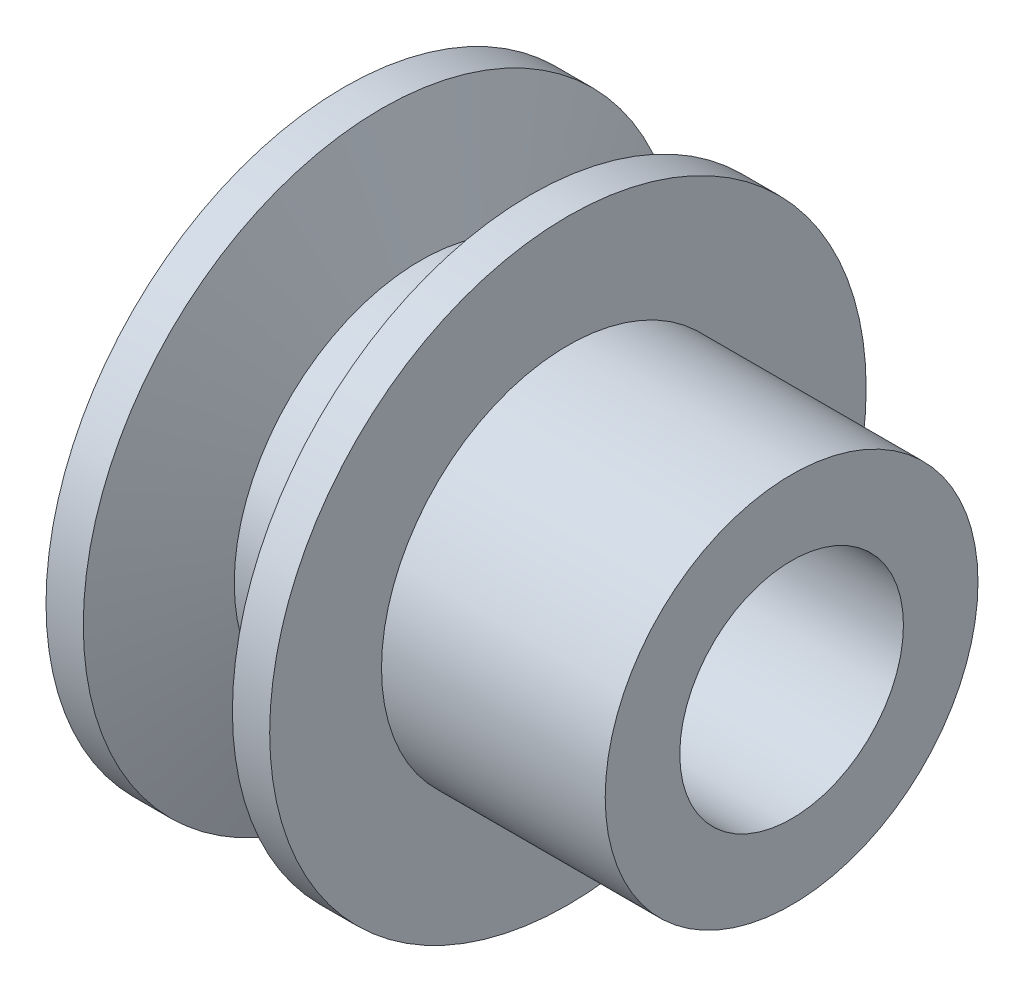
ISO-10303-21;
HEADER;
FILE_DESCRIPTION(('STEP AP214'),'2;1');
FILE_NAME('part.step','',(''),(''),'','','');
FILE_SCHEMA(('AUTOMOTIVE_DESIGN { 1 0 10303 214 1 1 1 1 }'));
ENDSEC;
DATA;
#1=APPLICATION_CONTEXT('core data for automotive mechanical design processes');
#2=APPLICATION_PROTOCOL_DEFINITION('international standard','automotive_design',2000,#1);
#3=PRODUCT_CONTEXT('',#1,'mechanical');
#4=PRODUCT('Part','Part','',(#3));
#5=PRODUCT_RELATED_PRODUCT_CATEGORY('part','',(#4));
#6=PRODUCT_DEFINITION_FORMATION('','',#4);
#7=PRODUCT_DEFINITION_CONTEXT('part definition',#1,'design');
#8=PRODUCT_DEFINITION('design','',#6,#7);
#9=PRODUCT_DEFINITION_SHAPE('','',#8);
#10=(LENGTH_UNIT() NAMED_UNIT(*) SI_UNIT(.MILLI.,.METRE.));
#11=(NAMED_UNIT(*) PLANE_ANGLE_UNIT() SI_UNIT($,.RADIAN.));
#12=(NAMED_UNIT(*) SI_UNIT($,.STERADIAN.) SOLID_ANGLE_UNIT());
#13=UNCERTAINTY_MEASURE_WITH_UNIT(LENGTH_MEASURE(1.E-05),#10,'distance_accuracy_value','');
#14=(GEOMETRIC_REPRESENTATION_CONTEXT(3) GLOBAL_UNCERTAINTY_ASSIGNED_CONTEXT((#13)) GLOBAL_UNIT_ASSIGNED_CONTEXT((#10,
#11,#12)) REPRESENTATION_CONTEXT('',''));
#15=CARTESIAN_POINT('',(0.,0.,0.));
#16=DIRECTION('',(0.,0.,1.));
#17=DIRECTION('',(1.,0.,0.));
#18=AXIS2_PLACEMENT_3D('',#15,#16,#17);
#19=CARTESIAN_POINT('',(-9.34873949579832,35.2170868347339,0.));
#20=DIRECTION('',(1.,0.,0.));
#21=DIRECTION('',(0.,0.,-1.));
#22=AXIS2_PLACEMENT_3D('',#19,#20,#21);
#23=PLANE('',#22);
#24=CARTESIAN_POINT('',(-9.34873949579832,0.,0.));
#25=DIRECTION('',(-1.,0.,0.));
#26=DIRECTION('',(0.,0.,1.));
#27=AXIS2_PLACEMENT_3D('',#24,#25,#26);
#28=CIRCLE('',#27,20.);
#29=CARTESIAN_POINT('',(-9.34873949579832,0.,20.));
#30=VERTEX_POINT('',#29);
#31=EDGE_CURVE('E10',#30,#30,#28,.T.);
#32=ORIENTED_EDGE('',*,*,#31,.F.);
#33=EDGE_LOOP('',(#32));
#34=FACE_BOUND('',#33,.T.);
#35=CARTESIAN_POINT('',(-9.34873949579832,0.,0.));
#36=DIRECTION('',(-1.,0.,0.));
#37=DIRECTION('',(0.,0.,1.));
#38=AXIS2_PLACEMENT_3D('',#35,#36,#37);
#39=CIRCLE('',#38,40.);
#40=CARTESIAN_POINT('',(-9.34873949579832,0.,40.));
#41=VERTEX_POINT('',#40);
#42=EDGE_CURVE('E72',#41,#41,#39,.T.);
#43=ORIENTED_EDGE('',*,*,#42,.T.);
#44=EDGE_LOOP('',(#43));
#45=FACE_BOUND('',#44,.T.);
#46=ADVANCED_FACE('F35',(#34,#45),#23,.F.);
#47=CARTESIAN_POINT('',(-9.34873949579832,0.,0.));
#48=DIRECTION('',(-1.,0.,0.));
#49=DIRECTION('',(0.,0.,1.));
#50=AXIS2_PLACEMENT_3D('',#47,#48,#49);
#51=CONICAL_SURFACE('',#50,20.,0.785398163397449);
#52=CARTESIAN_POINT('',(-4.34873949579832,0.,0.));
#53=DIRECTION('',(-1.,0.,0.));
#54=DIRECTION('',(0.,0.,1.));
#55=AXIS2_PLACEMENT_3D('',#52,#53,#54);
#56=CIRCLE('',#55,15.);
#57=CARTESIAN_POINT('',(-4.34873949579832,0.,15.));
#58=VERTEX_POINT('',#57);
#59=EDGE_CURVE('E41',#58,#58,#56,.T.);
#60=ORIENTED_EDGE('',*,*,#59,.F.);
#61=EDGE_LOOP('',(#60));
#62=FACE_BOUND('',#61,.T.);
#63=ORIENTED_EDGE('',*,*,#31,.T.);
#64=EDGE_LOOP('',(#63));
#65=FACE_BOUND('',#64,.T.);
#66=ADVANCED_FACE('F127',(#62,#65),#51,.F.);
#67=CARTESIAN_POINT('',(-23.1967787114846,0.,0.));
#68=DIRECTION('',(-1.,0.,0.));
#69=DIRECTION('',(0.,0.,1.));
#70=AXIS2_PLACEMENT_3D('',#67,#68,#69);
#71=CYLINDRICAL_SURFACE('',#70,15.);
#72=CARTESIAN_POINT('',(50.6512605042017,0.,0.));
#73=DIRECTION('',(-1.,0.,0.));
#74=DIRECTION('',(0.,0.,1.));
#75=AXIS2_PLACEMENT_3D('',#72,#73,#74);
#76=CIRCLE('',#75,15.);
#77=CARTESIAN_POINT('',(50.6512605042017,0.,15.));
#78=VERTEX_POINT('',#77);
#79=EDGE_CURVE('E45',#78,#78,#76,.T.);
#80=ORIENTED_EDGE('',*,*,#79,.F.);
#81=EDGE_LOOP('',(#80));
#82=FACE_BOUND('',#81,.T.);
#83=ORIENTED_EDGE('',*,*,#59,.T.);
#84=EDGE_LOOP('',(#83));
#85=FACE_BOUND('',#84,.T.);
#86=ADVANCED_FACE('F122',(#82,#85),#71,.F.);
#87=CARTESIAN_POINT('',(50.6512605042017,15.,0.));
#88=DIRECTION('',(-1.,0.,0.));
#89=DIRECTION('',(0.,0.,1.));
#90=AXIS2_PLACEMENT_3D('',#87,#88,#89);
#91=PLANE('',#90);
#92=CARTESIAN_POINT('',(50.6512605042017,0.,0.));
#93=DIRECTION('',(-1.,0.,0.));
#94=DIRECTION('',(0.,0.,1.));
#95=AXIS2_PLACEMENT_3D('',#92,#93,#94);
#96=CIRCLE('',#95,25.);
#97=CARTESIAN_POINT('',(50.6512605042017,0.,25.));
#98=VERTEX_POINT('',#97);
#99=EDGE_CURVE('E49',#98,#98,#96,.T.);
#100=ORIENTED_EDGE('',*,*,#99,.F.);
#101=EDGE_LOOP('',(#100));
#102=FACE_BOUND('',#101,.T.);
#103=ORIENTED_EDGE('',*,*,#79,.T.);
#104=EDGE_LOOP('',(#103));
#105=FACE_BOUND('',#104,.T.);
#106=ADVANCED_FACE('F116',(#102,#105),#91,.F.);
#107=CARTESIAN_POINT('',(-23.1967787114846,0.,0.));
#108=DIRECTION('',(-1.,0.,0.));
#109=DIRECTION('',(0.,0.,1.));
#110=AXIS2_PLACEMENT_3D('',#107,#108,#109);
#111=CYLINDRICAL_SURFACE('',#110,25.);
#112=CARTESIAN_POINT('',(20.6512605042017,0.,0.));
#113=DIRECTION('',(-1.,0.,0.));
#114=DIRECTION('',(0.,0.,1.));
#115=AXIS2_PLACEMENT_3D('',#112,#113,#114);
#116=CIRCLE('',#115,25.);
#117=CARTESIAN_POINT('',(20.6512605042017,0.,25.));
#118=VERTEX_POINT('',#117);
#119=EDGE_CURVE('E54',#118,#118,#116,.T.);
#120=ORIENTED_EDGE('',*,*,#119,.F.);
#121=EDGE_LOOP('',(#120));
#122=FACE_BOUND('',#121,.T.);
#123=ORIENTED_EDGE('',*,*,#99,.T.);
#124=EDGE_LOOP('',(#123));
#125=FACE_BOUND('',#124,.T.);
#126=ADVANCED_FACE('F110',(#122,#125),#111,.T.);
#127=CARTESIAN_POINT('',(20.6512605042017,25.,0.));
#128=DIRECTION('',(-1.,0.,0.));
#129=DIRECTION('',(0.,0.,1.));
#130=AXIS2_PLACEMENT_3D('',#127,#128,#129);
#131=PLANE('',#130);
#132=CARTESIAN_POINT('',(20.6512605042017,0.,0.));
#133=DIRECTION('',(-1.,0.,0.));
#134=DIRECTION('',(0.,0.,1.));
#135=AXIS2_PLACEMENT_3D('',#132,#133,#134);
#136=CIRCLE('',#135,40.);
#137=CARTESIAN_POINT('',(20.6512605042017,0.,40.));
#138=VERTEX_POINT('',#137);
#139=EDGE_CURVE('E57',#138,#138,#136,.T.);
#140=ORIENTED_EDGE('',*,*,#139,.F.);
#141=EDGE_LOOP('',(#140));
#142=FACE_BOUND('',#141,.T.);
#143=ORIENTED_EDGE('',*,*,#119,.T.);
#144=EDGE_LOOP('',(#143));
#145=FACE_BOUND('',#144,.T.);
#146=ADVANCED_FACE('F104',(#142,#145),#131,.F.);
#147=CARTESIAN_POINT('',(-23.1967787114846,0.,0.));
#148=DIRECTION('',(-1.,0.,0.));
#149=DIRECTION('',(0.,0.,1.));
#150=AXIS2_PLACEMENT_3D('',#147,#148,#149);
#151=CYLINDRICAL_SURFACE('',#150,40.);
#152=CARTESIAN_POINT('',(15.6512605042017,0.,0.));
#153=DIRECTION('',(-1.,0.,0.));
#154=DIRECTION('',(0.,0.,1.));
#155=AXIS2_PLACEMENT_3D('',#152,#153,#154);
#156=CIRCLE('',#155,40.);
#157=CARTESIAN_POINT('',(15.6512605042017,0.,40.));
#158=VERTEX_POINT('',#157);
#159=EDGE_CURVE('E60',#158,#158,#156,.T.);
#160=ORIENTED_EDGE('',*,*,#159,.F.);
#161=EDGE_LOOP('',(#160));
#162=FACE_BOUND('',#161,.T.);
#163=ORIENTED_EDGE('',*,*,#139,.T.);
#164=EDGE_LOOP('',(#163));
#165=FACE_BOUND('',#164,.T.);
#166=ADVANCED_FACE('F98',(#162,#165),#151,.T.);
#167=CARTESIAN_POINT('',(15.6512605042017,0.,0.));
#168=DIRECTION('',(1.,0.,0.));
#169=DIRECTION('',(0.,0.,-1.));
#170=AXIS2_PLACEMENT_3D('',#167,#168,#169);
#171=CONICAL_SURFACE('',#170,40.,1.20926577392723);
#172=CARTESIAN_POINT('',(9.97899159663866,0.,0.));
#173=DIRECTION('',(-1.,0.,0.));
#174=DIRECTION('',(0.,0.,1.));
#175=AXIS2_PLACEMENT_3D('',#172,#173,#174);
#176=CIRCLE('',#175,25.);
#177=CARTESIAN_POINT('',(9.97899159663866,0.,25.));
#178=VERTEX_POINT('',#177);
#179=EDGE_CURVE('E63',#178,#178,#176,.T.);
#180=ORIENTED_EDGE('',*,*,#179,.F.);
#181=EDGE_LOOP('',(#180));
#182=FACE_BOUND('',#181,.T.);
#183=ORIENTED_EDGE('',*,*,#159,.T.);
#184=EDGE_LOOP('',(#183));
#185=FACE_BOUND('',#184,.T.);
#186=ADVANCED_FACE('F92',(#182,#185),#171,.T.);
#187=CARTESIAN_POINT('',(-23.1967787114846,0.,0.));
#188=DIRECTION('',(-1.,0.,0.));
#189=DIRECTION('',(0.,0.,1.));
#190=AXIS2_PLACEMENT_3D('',#187,#188,#189);
#191=CYLINDRICAL_SURFACE('',#190,25.);
#192=CARTESIAN_POINT('',(0.900020093031771,0.,0.));
#193=DIRECTION('',(-1.,0.,0.));
#194=DIRECTION('',(0.,0.,1.));
#195=AXIS2_PLACEMENT_3D('',#192,#193,#194);
#196=CIRCLE('',#195,25.);
#197=CARTESIAN_POINT('',(0.900020093031771,0.,25.));
#198=VERTEX_POINT('',#197);
#199=EDGE_CURVE('E66',#198,#198,#196,.T.);
#200=ORIENTED_EDGE('',*,*,#199,.F.);
#201=EDGE_LOOP('',(#200));
#202=FACE_BOUND('',#201,.T.);
#203=ORIENTED_EDGE('',*,*,#179,.T.);
#204=EDGE_LOOP('',(#203));
#205=FACE_BOUND('',#204,.T.);
#206=ADVANCED_FACE('F86',(#202,#205),#191,.T.);
#207=CARTESIAN_POINT('',(0.900020093031771,0.,0.));
#208=DIRECTION('',(-1.,0.,0.));
#209=DIRECTION('',(0.,0.,1.));
#210=AXIS2_PLACEMENT_3D('',#207,#208,#209);
#211=CONICAL_SURFACE('',#210,25.,1.23419517886484);
#212=CARTESIAN_POINT('',(-4.34873949579832,0.,0.));
#213=DIRECTION('',(-1.,0.,0.));
#214=DIRECTION('',(0.,0.,1.));
#215=AXIS2_PLACEMENT_3D('',#212,#213,#214);
#216=CIRCLE('',#215,40.);
#217=CARTESIAN_POINT('',(-4.34873949579832,0.,40.));
#218=VERTEX_POINT('',#217);
#219=EDGE_CURVE('E69',#218,#218,#216,.T.);
#220=ORIENTED_EDGE('',*,*,#219,.F.);
#221=EDGE_LOOP('',(#220));
#222=FACE_BOUND('',#221,.T.);
#223=ORIENTED_EDGE('',*,*,#199,.T.);
#224=EDGE_LOOP('',(#223));
#225=FACE_BOUND('',#224,.T.);
#226=ADVANCED_FACE('F80',(#222,#225),#211,.T.);
#227=CARTESIAN_POINT('',(-23.1967787114846,0.,0.));
#228=DIRECTION('',(-1.,0.,0.));
#229=DIRECTION('',(0.,0.,1.));
#230=AXIS2_PLACEMENT_3D('',#227,#228,#229);
#231=CYLINDRICAL_SURFACE('',#230,40.);
#232=ORIENTED_EDGE('',*,*,#42,.F.);
#233=EDGE_LOOP('',(#232));
#234=FACE_BOUND('',#233,.T.);
#235=ORIENTED_EDGE('',*,*,#219,.T.);
#236=EDGE_LOOP('',(#235));
#237=FACE_BOUND('',#236,.T.);
#238=ADVANCED_FACE('F77',(#234,#237),#231,.T.);
#239=CLOSED_SHELL('',(#46,#66,#86,#106,#126,#146,#166,#186,#206,#226,#238));
#240=MANIFOLD_SOLID_BREP('B2',#239);
#241=ADVANCED_BREP_SHAPE_REPRESENTATION('',(#18,#240),#14);
#242=SHAPE_DEFINITION_REPRESENTATION(#9,#241);
ENDSEC;
END-ISO-10303-21;
